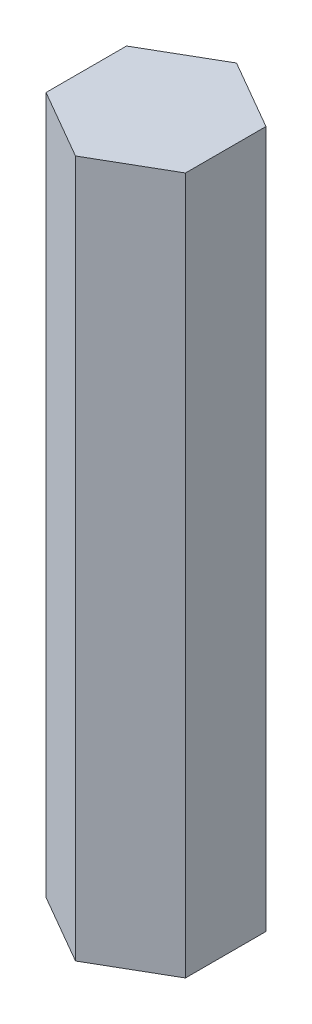
ISO-10303-21;
HEADER;
FILE_DESCRIPTION(('STEP AP214'),'2;1');
FILE_NAME('part.step','',(''),(''),'','','');
FILE_SCHEMA(('AUTOMOTIVE_DESIGN { 1 0 10303 214 1 1 1 1 }'));
ENDSEC;
DATA;
#1=APPLICATION_CONTEXT('core data for automotive mechanical design processes');
#2=APPLICATION_PROTOCOL_DEFINITION('international standard','automotive_design',2000,#1);
#3=PRODUCT_CONTEXT('',#1,'mechanical');
#4=PRODUCT('Part','Part','',(#3));
#5=PRODUCT_RELATED_PRODUCT_CATEGORY('part','',(#4));
#6=PRODUCT_DEFINITION_FORMATION('','',#4);
#7=PRODUCT_DEFINITION_CONTEXT('part definition',#1,'design');
#8=PRODUCT_DEFINITION('design','',#6,#7);
#9=PRODUCT_DEFINITION_SHAPE('','',#8);
#10=(LENGTH_UNIT() NAMED_UNIT(*) SI_UNIT(.MILLI.,.METRE.));
#11=(NAMED_UNIT(*) PLANE_ANGLE_UNIT() SI_UNIT($,.RADIAN.));
#12=(NAMED_UNIT(*) SI_UNIT($,.STERADIAN.) SOLID_ANGLE_UNIT());
#13=UNCERTAINTY_MEASURE_WITH_UNIT(LENGTH_MEASURE(1.E-05),#10,'distance_accuracy_value','');
#14=(GEOMETRIC_REPRESENTATION_CONTEXT(3) GLOBAL_UNCERTAINTY_ASSIGNED_CONTEXT((#13)) GLOBAL_UNIT_ASSIGNED_CONTEXT((#10,
#11,#12)) REPRESENTATION_CONTEXT('',''));
#15=CARTESIAN_POINT('',(0.,0.,0.));
#16=DIRECTION('',(0.,0.,1.));
#17=DIRECTION('',(1.,0.,0.));
#18=AXIS2_PLACEMENT_3D('',#15,#16,#17);
#19=CARTESIAN_POINT('',(0.,25.,2.88675134594813));
#20=DIRECTION('',(-0.5,0.,-0.866025403784438));
#21=DIRECTION('',(-0.866025403784439,0.,0.5));
#22=AXIS2_PLACEMENT_3D('',#19,#20,#21);
#23=PLANE('',#22);
#24=DIRECTION('',(0.866025403784438,0.,-0.5));
#25=VECTOR('',#24,1.);
#26=CARTESIAN_POINT('',(0.,0.,2.88675134594813));
#27=LINE('',#26,#25);
#28=CARTESIAN_POINT('',(0.,0.,2.88675134594813));
#29=VERTEX_POINT('',#28);
#30=CARTESIAN_POINT('',(2.5,0.,1.44337567297406));
#31=VERTEX_POINT('',#30);
#32=EDGE_CURVE('E115',#29,#31,#27,.T.);
#33=ORIENTED_EDGE('',*,*,#32,.T.);
#34=DIRECTION('',(0.,-1.,0.));
#35=VECTOR('',#34,1.);
#36=CARTESIAN_POINT('',(2.5,25.,1.44337567297406));
#37=LINE('',#36,#35);
#38=CARTESIAN_POINT('',(2.5,25.,1.44337567297406));
#39=VERTEX_POINT('',#38);
#40=EDGE_CURVE('E11',#39,#31,#37,.T.);
#41=ORIENTED_EDGE('',*,*,#40,.F.);
#42=DIRECTION('',(0.866025403784438,0.,-0.5));
#43=VECTOR('',#42,1.);
#44=CARTESIAN_POINT('',(0.,25.,2.88675134594813));
#45=LINE('',#44,#43);
#46=CARTESIAN_POINT('',(0.,25.,2.88675134594813));
#47=VERTEX_POINT('',#46);
#48=EDGE_CURVE('E125',#47,#39,#45,.T.);
#49=ORIENTED_EDGE('',*,*,#48,.F.);
#50=DIRECTION('',(0.,-1.,0.));
#51=VECTOR('',#50,1.);
#52=CARTESIAN_POINT('',(0.,25.,2.88675134594813));
#53=LINE('',#52,#51);
#54=EDGE_CURVE('E111',#47,#29,#53,.T.);
#55=ORIENTED_EDGE('',*,*,#54,.T.);
#56=EDGE_LOOP('',(#33,#41,#49,#55));
#57=FACE_BOUND('',#56,.T.);
#58=ADVANCED_FACE('F31',(#57),#23,.F.);
#59=CARTESIAN_POINT('',(2.5,25.,1.44337567297406));
#60=DIRECTION('',(-1.,0.,0.));
#61=DIRECTION('',(0.,0.,1.));
#62=AXIS2_PLACEMENT_3D('',#59,#60,#61);
#63=PLANE('',#62);
#64=DIRECTION('',(0.,0.,-1.));
#65=VECTOR('',#64,1.);
#66=CARTESIAN_POINT('',(2.5,0.,1.44337567297406));
#67=LINE('',#66,#65);
#68=CARTESIAN_POINT('',(2.5,0.,-1.44337567297407));
#69=VERTEX_POINT('',#68);
#70=EDGE_CURVE('E118',#31,#69,#67,.T.);
#71=ORIENTED_EDGE('',*,*,#70,.T.);
#72=DIRECTION('',(0.,-1.,0.));
#73=VECTOR('',#72,1.);
#74=CARTESIAN_POINT('',(2.5,25.,-1.44337567297407));
#75=LINE('',#74,#73);
#76=CARTESIAN_POINT('',(2.5,25.,-1.44337567297407));
#77=VERTEX_POINT('',#76);
#78=EDGE_CURVE('E39',#77,#69,#75,.T.);
#79=ORIENTED_EDGE('',*,*,#78,.F.);
#80=DIRECTION('',(0.,0.,-1.));
#81=VECTOR('',#80,1.);
#82=CARTESIAN_POINT('',(2.5,25.,1.44337567297406));
#83=LINE('',#82,#81);
#84=EDGE_CURVE('E84',#39,#77,#83,.T.);
#85=ORIENTED_EDGE('',*,*,#84,.F.);
#86=ORIENTED_EDGE('',*,*,#40,.T.);
#87=EDGE_LOOP('',(#71,#79,#85,#86));
#88=FACE_BOUND('',#87,.T.);
#89=ADVANCED_FACE('F149',(#88),#63,.F.);
#90=CARTESIAN_POINT('',(2.5,25.,-1.44337567297407));
#91=DIRECTION('',(-0.5,0.,0.866025403784438));
#92=DIRECTION('',(0.866025403784439,0.,0.5));
#93=AXIS2_PLACEMENT_3D('',#90,#91,#92);
#94=PLANE('',#93);
#95=DIRECTION('',(-0.866025403784438,0.,-0.5));
#96=VECTOR('',#95,1.);
#97=CARTESIAN_POINT('',(2.5,0.,-1.44337567297407));
#98=LINE('',#97,#96);
#99=CARTESIAN_POINT('',(0.,0.,-2.88675134594813));
#100=VERTEX_POINT('',#99);
#101=EDGE_CURVE('E120',#69,#100,#98,.T.);
#102=ORIENTED_EDGE('',*,*,#101,.T.);
#103=DIRECTION('',(0.,-1.,0.));
#104=VECTOR('',#103,1.);
#105=CARTESIAN_POINT('',(0.,25.,-2.88675134594813));
#106=LINE('',#105,#104);
#107=CARTESIAN_POINT('',(0.,25.,-2.88675134594813));
#108=VERTEX_POINT('',#107);
#109=EDGE_CURVE('E106',#108,#100,#106,.T.);
#110=ORIENTED_EDGE('',*,*,#109,.F.);
#111=DIRECTION('',(-0.866025403784438,0.,-0.5));
#112=VECTOR('',#111,1.);
#113=CARTESIAN_POINT('',(2.5,25.,-1.44337567297407));
#114=LINE('',#113,#112);
#115=EDGE_CURVE('E97',#77,#108,#114,.T.);
#116=ORIENTED_EDGE('',*,*,#115,.F.);
#117=ORIENTED_EDGE('',*,*,#78,.T.);
#118=EDGE_LOOP('',(#102,#110,#116,#117));
#119=FACE_BOUND('',#118,.T.);
#120=ADVANCED_FACE('F131',(#119),#94,.F.);
#121=CARTESIAN_POINT('',(0.,25.,-2.88675134594813));
#122=DIRECTION('',(0.5,0.,0.866025403784439));
#123=DIRECTION('',(0.866025403784439,0.,-0.5));
#124=AXIS2_PLACEMENT_3D('',#121,#122,#123);
#125=PLANE('',#124);
#126=DIRECTION('',(-0.866025403784439,0.,0.5));
#127=VECTOR('',#126,1.);
#128=CARTESIAN_POINT('',(0.,0.,-2.88675134594813));
#129=LINE('',#128,#127);
#130=CARTESIAN_POINT('',(-2.5,0.,-1.44337567297407));
#131=VERTEX_POINT('',#130);
#132=EDGE_CURVE('E105',#100,#131,#129,.T.);
#133=ORIENTED_EDGE('',*,*,#132,.T.);
#134=DIRECTION('',(0.,-1.,0.));
#135=VECTOR('',#134,1.);
#136=CARTESIAN_POINT('',(-2.5,25.,-1.44337567297407));
#137=LINE('',#136,#135);
#138=CARTESIAN_POINT('',(-2.5,25.,-1.44337567297407));
#139=VERTEX_POINT('',#138);
#140=EDGE_CURVE('E102',#139,#131,#137,.T.);
#141=ORIENTED_EDGE('',*,*,#140,.F.);
#142=DIRECTION('',(-0.866025403784439,0.,0.5));
#143=VECTOR('',#142,1.);
#144=CARTESIAN_POINT('',(0.,25.,-2.88675134594813));
#145=LINE('',#144,#143);
#146=EDGE_CURVE('E91',#108,#139,#145,.T.);
#147=ORIENTED_EDGE('',*,*,#146,.F.);
#148=ORIENTED_EDGE('',*,*,#109,.T.);
#149=EDGE_LOOP('',(#133,#141,#147,#148));
#150=FACE_BOUND('',#149,.T.);
#151=ADVANCED_FACE('F103',(#150),#125,.F.);
#152=CARTESIAN_POINT('',(-2.5,25.,-1.44337567297407));
#153=DIRECTION('',(1.,0.,0.));
#154=DIRECTION('',(0.,0.,-1.));
#155=AXIS2_PLACEMENT_3D('',#152,#153,#154);
#156=PLANE('',#155);
#157=DIRECTION('',(0.,0.,1.));
#158=VECTOR('',#157,1.);
#159=CARTESIAN_POINT('',(-2.5,0.,-1.44337567297407));
#160=LINE('',#159,#158);
#161=CARTESIAN_POINT('',(-2.5,0.,1.44337567297406));
#162=VERTEX_POINT('',#161);
#163=EDGE_CURVE('E70',#131,#162,#160,.T.);
#164=ORIENTED_EDGE('',*,*,#163,.T.);
#165=DIRECTION('',(0.,-1.,0.));
#166=VECTOR('',#165,1.);
#167=CARTESIAN_POINT('',(-2.5,25.,1.44337567297406));
#168=LINE('',#167,#166);
#169=CARTESIAN_POINT('',(-2.5,25.,1.44337567297406));
#170=VERTEX_POINT('',#169);
#171=EDGE_CURVE('E107',#170,#162,#168,.T.);
#172=ORIENTED_EDGE('',*,*,#171,.F.);
#173=DIRECTION('',(0.,0.,1.));
#174=VECTOR('',#173,1.);
#175=CARTESIAN_POINT('',(-2.5,25.,-1.44337567297407));
#176=LINE('',#175,#174);
#177=EDGE_CURVE('E95',#139,#170,#176,.T.);
#178=ORIENTED_EDGE('',*,*,#177,.F.);
#179=ORIENTED_EDGE('',*,*,#140,.T.);
#180=EDGE_LOOP('',(#164,#172,#178,#179));
#181=FACE_BOUND('',#180,.T.);
#182=ADVANCED_FACE('F109',(#181),#156,.F.);
#183=CARTESIAN_POINT('',(-2.5,25.,1.44337567297406));
#184=DIRECTION('',(0.5,0.,-0.866025403784438));
#185=DIRECTION('',(-0.866025403784439,0.,-0.5));
#186=AXIS2_PLACEMENT_3D('',#183,#184,#185);
#187=PLANE('',#186);
#188=DIRECTION('',(0.866025403784438,0.,0.5));
#189=VECTOR('',#188,1.);
#190=CARTESIAN_POINT('',(-2.5,0.,1.44337567297406));
#191=LINE('',#190,#189);
#192=EDGE_CURVE('E76',#162,#29,#191,.T.);
#193=ORIENTED_EDGE('',*,*,#192,.T.);
#194=ORIENTED_EDGE('',*,*,#54,.F.);
#195=DIRECTION('',(0.866025403784438,0.,0.5));
#196=VECTOR('',#195,1.);
#197=CARTESIAN_POINT('',(-2.5,25.,1.44337567297406));
#198=LINE('',#197,#196);
#199=EDGE_CURVE('E47',#170,#47,#198,.T.);
#200=ORIENTED_EDGE('',*,*,#199,.F.);
#201=ORIENTED_EDGE('',*,*,#171,.T.);
#202=EDGE_LOOP('',(#193,#194,#200,#201));
#203=FACE_BOUND('',#202,.T.);
#204=ADVANCED_FACE('F138',(#203),#187,.F.);
#205=CARTESIAN_POINT('',(2.5,25.,1.44337567297406));
#206=DIRECTION('',(0.,1.,0.));
#207=DIRECTION('',(0.,0.,1.));
#208=AXIS2_PLACEMENT_3D('',#205,#206,#207);
#209=PLANE('',#208);
#210=ORIENTED_EDGE('',*,*,#48,.T.);
#211=ORIENTED_EDGE('',*,*,#84,.T.);
#212=ORIENTED_EDGE('',*,*,#115,.T.);
#213=ORIENTED_EDGE('',*,*,#146,.T.);
#214=ORIENTED_EDGE('',*,*,#177,.T.);
#215=ORIENTED_EDGE('',*,*,#199,.T.);
#216=EDGE_LOOP('',(#210,#211,#212,#213,#214,#215));
#217=FACE_BOUND('',#216,.T.);
#218=ADVANCED_FACE('F93',(#217),#209,.T.);
#219=CARTESIAN_POINT('',(2.5,0.,1.44337567297406));
#220=DIRECTION('',(0.,1.,0.));
#221=DIRECTION('',(0.,0.,1.));
#222=AXIS2_PLACEMENT_3D('',#219,#220,#221);
#223=PLANE('',#222);
#224=ORIENTED_EDGE('',*,*,#32,.F.);
#225=ORIENTED_EDGE('',*,*,#192,.F.);
#226=ORIENTED_EDGE('',*,*,#163,.F.);
#227=ORIENTED_EDGE('',*,*,#132,.F.);
#228=ORIENTED_EDGE('',*,*,#101,.F.);
#229=ORIENTED_EDGE('',*,*,#70,.F.);
#230=EDGE_LOOP('',(#224,#225,#226,#227,#228,#229));
#231=FACE_BOUND('',#230,.T.);
#232=ADVANCED_FACE('F134',(#231),#223,.F.);
#233=CLOSED_SHELL('',(#58,#89,#120,#151,#182,#204,#218,#232));
#234=MANIFOLD_SOLID_BREP('B2',#233);
#235=ADVANCED_BREP_SHAPE_REPRESENTATION('',(#18,#234),#14);
#236=SHAPE_DEFINITION_REPRESENTATION(#9,#235);
ENDSEC;
END-ISO-10303-21;
